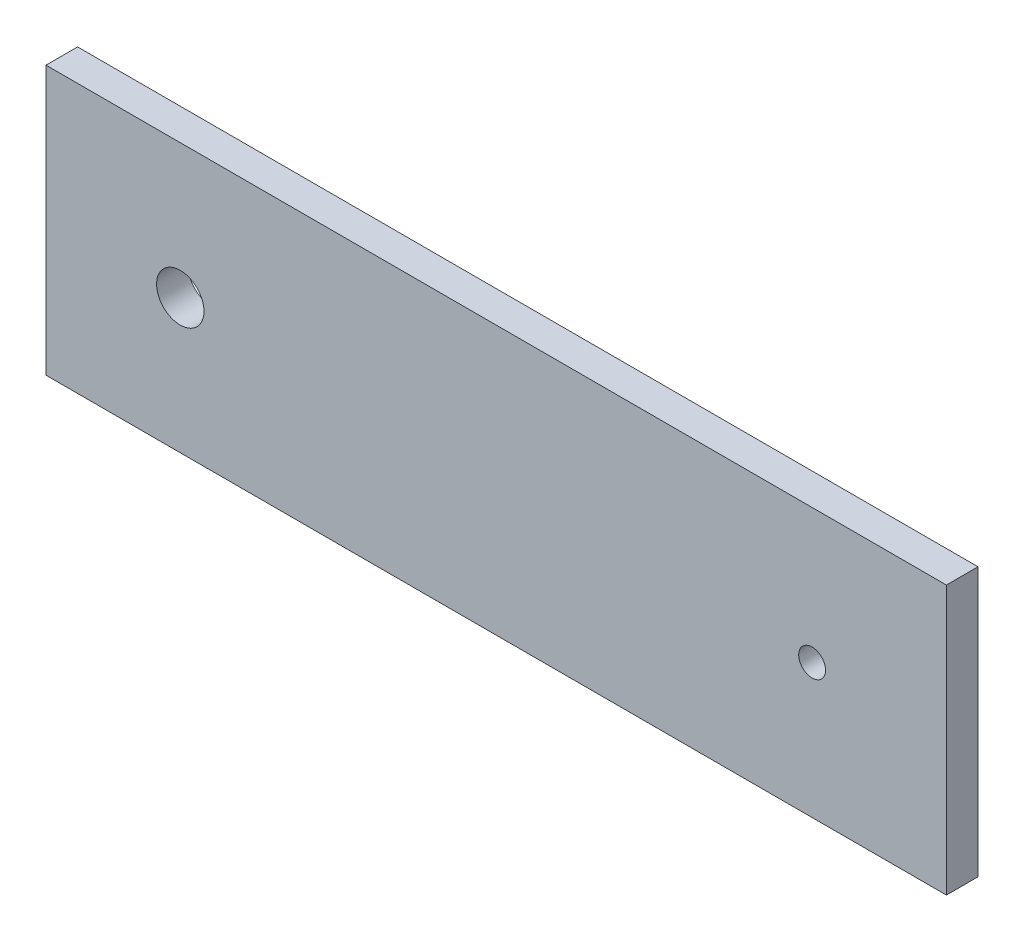
ISO-10303-21;
HEADER;
FILE_DESCRIPTION(('STEP AP214'),'2;1');
FILE_NAME('part.step','',(''),(''),'','','');
FILE_SCHEMA(('AUTOMOTIVE_DESIGN { 1 0 10303 214 1 1 1 1 }'));
ENDSEC;
DATA;
#1=APPLICATION_CONTEXT('core data for automotive mechanical design processes');
#2=APPLICATION_PROTOCOL_DEFINITION('international standard','automotive_design',2000,#1);
#3=PRODUCT_CONTEXT('',#1,'mechanical');
#4=PRODUCT('Part','Part','',(#3));
#5=PRODUCT_RELATED_PRODUCT_CATEGORY('part','',(#4));
#6=PRODUCT_DEFINITION_FORMATION('','',#4);
#7=PRODUCT_DEFINITION_CONTEXT('part definition',#1,'design');
#8=PRODUCT_DEFINITION('design','',#6,#7);
#9=PRODUCT_DEFINITION_SHAPE('','',#8);
#10=(LENGTH_UNIT() NAMED_UNIT(*) SI_UNIT(.MILLI.,.METRE.));
#11=(NAMED_UNIT(*) PLANE_ANGLE_UNIT() SI_UNIT($,.RADIAN.));
#12=(NAMED_UNIT(*) SI_UNIT($,.STERADIAN.) SOLID_ANGLE_UNIT());
#13=UNCERTAINTY_MEASURE_WITH_UNIT(LENGTH_MEASURE(1.E-05),#10,'distance_accuracy_value','');
#14=(GEOMETRIC_REPRESENTATION_CONTEXT(3) GLOBAL_UNCERTAINTY_ASSIGNED_CONTEXT((#13)) GLOBAL_UNIT_ASSIGNED_CONTEXT((#10,
#11,#12)) REPRESENTATION_CONTEXT('',''));
#15=CARTESIAN_POINT('',(0.,0.,0.));
#16=DIRECTION('',(0.,0.,1.));
#17=DIRECTION('',(1.,0.,0.));
#18=AXIS2_PLACEMENT_3D('',#15,#16,#17);
#19=CARTESIAN_POINT('',(0.,0.,2.));
#20=DIRECTION('',(0.,0.,-1.));
#21=DIRECTION('',(-1.,0.,0.));
#22=AXIS2_PLACEMENT_3D('',#19,#20,#21);
#23=PLANE('',#22);
#24=DIRECTION('',(0.,1.,0.));
#25=VECTOR('',#24,1.);
#26=CARTESIAN_POINT('',(97.,-17.,2.));
#27=LINE('',#26,#25);
#28=CARTESIAN_POINT('',(97.,-17.,2.));
#29=VERTEX_POINT('',#28);
#30=CARTESIAN_POINT('',(97.,17.,2.));
#31=VERTEX_POINT('',#30);
#32=EDGE_CURVE('E99',#29,#31,#27,.T.);
#33=ORIENTED_EDGE('',*,*,#32,.T.);
#34=DIRECTION('',(-1.,0.,0.));
#35=VECTOR('',#34,1.);
#36=CARTESIAN_POINT('',(-17.,17.,2.));
#37=LINE('',#36,#35);
#38=CARTESIAN_POINT('',(-17.,17.,2.));
#39=VERTEX_POINT('',#38);
#40=EDGE_CURVE('E92',#31,#39,#37,.T.);
#41=ORIENTED_EDGE('',*,*,#40,.T.);
#42=DIRECTION('',(0.,-1.,0.));
#43=VECTOR('',#42,1.);
#44=CARTESIAN_POINT('',(-17.,-17.,2.));
#45=LINE('',#44,#43);
#46=CARTESIAN_POINT('',(-17.,-17.,2.));
#47=VERTEX_POINT('',#46);
#48=EDGE_CURVE('E98',#39,#47,#45,.T.);
#49=ORIENTED_EDGE('',*,*,#48,.T.);
#50=DIRECTION('',(1.,0.,0.));
#51=VECTOR('',#50,1.);
#52=CARTESIAN_POINT('',(-17.,-17.,2.));
#53=LINE('',#52,#51);
#54=EDGE_CURVE('E63',#47,#29,#53,.T.);
#55=ORIENTED_EDGE('',*,*,#54,.T.);
#56=EDGE_LOOP('',(#33,#41,#49,#55));
#57=FACE_BOUND('',#56,.T.);
#58=CARTESIAN_POINT('',(0.,0.,2.));
#59=DIRECTION('',(0.,0.,1.));
#60=DIRECTION('',(1.,0.,0.));
#61=AXIS2_PLACEMENT_3D('',#58,#59,#60);
#62=CIRCLE('',#61,3.);
#63=CARTESIAN_POINT('',(3.,0.,2.));
#64=VERTEX_POINT('',#63);
#65=EDGE_CURVE('E113',#64,#64,#62,.T.);
#66=ORIENTED_EDGE('',*,*,#65,.F.);
#67=EDGE_LOOP('',(#66));
#68=FACE_BOUND('',#67,.T.);
#69=CARTESIAN_POINT('',(80.,0.,2.));
#70=DIRECTION('',(0.,0.,1.));
#71=DIRECTION('',(1.,0.,0.));
#72=AXIS2_PLACEMENT_3D('',#69,#70,#71);
#73=CIRCLE('',#72,1.69999999999999);
#74=CARTESIAN_POINT('',(81.7,0.,2.));
#75=VERTEX_POINT('',#74);
#76=EDGE_CURVE('E128',#75,#75,#73,.T.);
#77=ORIENTED_EDGE('',*,*,#76,.F.);
#78=EDGE_LOOP('',(#77));
#79=FACE_BOUND('',#78,.T.);
#80=ADVANCED_FACE('F50',(#57,#68,#79),#23,.F.);
#81=CARTESIAN_POINT('',(0.,0.,-2.));
#82=DIRECTION('',(0.,0.,-1.));
#83=DIRECTION('',(-1.,0.,0.));
#84=AXIS2_PLACEMENT_3D('',#81,#82,#83);
#85=PLANE('',#84);
#86=CARTESIAN_POINT('',(0.,0.,-2.));
#87=DIRECTION('',(0.,0.,1.));
#88=DIRECTION('',(1.,0.,0.));
#89=AXIS2_PLACEMENT_3D('',#86,#87,#88);
#90=CIRCLE('',#89,3.);
#91=CARTESIAN_POINT('',(3.,0.,-2.));
#92=VERTEX_POINT('',#91);
#93=EDGE_CURVE('E130',#92,#92,#90,.T.);
#94=ORIENTED_EDGE('',*,*,#93,.T.);
#95=EDGE_LOOP('',(#94));
#96=FACE_BOUND('',#95,.T.);
#97=DIRECTION('',(0.,1.,0.));
#98=VECTOR('',#97,1.);
#99=CARTESIAN_POINT('',(97.,-17.,-2.));
#100=LINE('',#99,#98);
#101=CARTESIAN_POINT('',(97.,-17.,-2.));
#102=VERTEX_POINT('',#101);
#103=CARTESIAN_POINT('',(97.,17.,-2.));
#104=VERTEX_POINT('',#103);
#105=EDGE_CURVE('E115',#102,#104,#100,.T.);
#106=ORIENTED_EDGE('',*,*,#105,.F.);
#107=DIRECTION('',(1.,0.,0.));
#108=VECTOR('',#107,1.);
#109=CARTESIAN_POINT('',(-17.,-17.,-2.));
#110=LINE('',#109,#108);
#111=CARTESIAN_POINT('',(-17.,-17.,-2.));
#112=VERTEX_POINT('',#111);
#113=EDGE_CURVE('E86',#112,#102,#110,.T.);
#114=ORIENTED_EDGE('',*,*,#113,.F.);
#115=DIRECTION('',(0.,-1.,0.));
#116=VECTOR('',#115,1.);
#117=CARTESIAN_POINT('',(-17.,-17.,-2.));
#118=LINE('',#117,#116);
#119=CARTESIAN_POINT('',(-17.,17.,-2.));
#120=VERTEX_POINT('',#119);
#121=EDGE_CURVE('E82',#120,#112,#118,.T.);
#122=ORIENTED_EDGE('',*,*,#121,.F.);
#123=DIRECTION('',(-1.,0.,0.));
#124=VECTOR('',#123,1.);
#125=CARTESIAN_POINT('',(-17.,17.,-2.));
#126=LINE('',#125,#124);
#127=EDGE_CURVE('E102',#104,#120,#126,.T.);
#128=ORIENTED_EDGE('',*,*,#127,.F.);
#129=EDGE_LOOP('',(#106,#114,#122,#128));
#130=FACE_BOUND('',#129,.T.);
#131=CARTESIAN_POINT('',(80.,0.,-2.));
#132=DIRECTION('',(0.,0.,1.));
#133=DIRECTION('',(1.,0.,0.));
#134=AXIS2_PLACEMENT_3D('',#131,#132,#133);
#135=CIRCLE('',#134,1.69999999999999);
#136=CARTESIAN_POINT('',(81.7,0.,-2.));
#137=VERTEX_POINT('',#136);
#138=EDGE_CURVE('E135',#137,#137,#135,.T.);
#139=ORIENTED_EDGE('',*,*,#138,.T.);
#140=EDGE_LOOP('',(#139));
#141=FACE_BOUND('',#140,.T.);
#142=ADVANCED_FACE('F124',(#96,#130,#141),#85,.T.);
#143=CARTESIAN_POINT('',(97.,-17.,2.));
#144=DIRECTION('',(-1.,0.,0.));
#145=DIRECTION('',(0.,0.,1.));
#146=AXIS2_PLACEMENT_3D('',#143,#144,#145);
#147=PLANE('',#146);
#148=ORIENTED_EDGE('',*,*,#105,.T.);
#149=DIRECTION('',(0.,0.,-1.));
#150=VECTOR('',#149,1.);
#151=CARTESIAN_POINT('',(97.,17.,2.));
#152=LINE('',#151,#150);
#153=EDGE_CURVE('E11',#31,#104,#152,.T.);
#154=ORIENTED_EDGE('',*,*,#153,.F.);
#155=ORIENTED_EDGE('',*,*,#32,.F.);
#156=DIRECTION('',(0.,0.,-1.));
#157=VECTOR('',#156,1.);
#158=CARTESIAN_POINT('',(97.,-17.,2.));
#159=LINE('',#158,#157);
#160=EDGE_CURVE('E107',#29,#102,#159,.T.);
#161=ORIENTED_EDGE('',*,*,#160,.T.);
#162=EDGE_LOOP('',(#148,#154,#155,#161));
#163=FACE_BOUND('',#162,.T.);
#164=ADVANCED_FACE('F49',(#163),#147,.F.);
#165=CARTESIAN_POINT('',(-17.,17.,2.));
#166=DIRECTION('',(0.,-1.,0.));
#167=DIRECTION('',(0.,0.,-1.));
#168=AXIS2_PLACEMENT_3D('',#165,#166,#167);
#169=PLANE('',#168);
#170=ORIENTED_EDGE('',*,*,#127,.T.);
#171=DIRECTION('',(0.,0.,-1.));
#172=VECTOR('',#171,1.);
#173=CARTESIAN_POINT('',(-17.,17.,2.));
#174=LINE('',#173,#172);
#175=EDGE_CURVE('E60',#39,#120,#174,.T.);
#176=ORIENTED_EDGE('',*,*,#175,.F.);
#177=ORIENTED_EDGE('',*,*,#40,.F.);
#178=ORIENTED_EDGE('',*,*,#153,.T.);
#179=EDGE_LOOP('',(#170,#176,#177,#178));
#180=FACE_BOUND('',#179,.T.);
#181=ADVANCED_FACE('F103',(#180),#169,.F.);
#182=CARTESIAN_POINT('',(-17.,-17.,2.));
#183=DIRECTION('',(1.,0.,0.));
#184=DIRECTION('',(0.,0.,-1.));
#185=AXIS2_PLACEMENT_3D('',#182,#183,#184);
#186=PLANE('',#185);
#187=ORIENTED_EDGE('',*,*,#121,.T.);
#188=DIRECTION('',(0.,0.,-1.));
#189=VECTOR('',#188,1.);
#190=CARTESIAN_POINT('',(-17.,-17.,2.));
#191=LINE('',#190,#189);
#192=EDGE_CURVE('E104',#47,#112,#191,.T.);
#193=ORIENTED_EDGE('',*,*,#192,.F.);
#194=ORIENTED_EDGE('',*,*,#48,.F.);
#195=ORIENTED_EDGE('',*,*,#175,.T.);
#196=EDGE_LOOP('',(#187,#193,#194,#195));
#197=FACE_BOUND('',#196,.T.);
#198=ADVANCED_FACE('F106',(#197),#186,.F.);
#199=CARTESIAN_POINT('',(-17.,-17.,2.));
#200=DIRECTION('',(0.,1.,0.));
#201=DIRECTION('',(0.,0.,1.));
#202=AXIS2_PLACEMENT_3D('',#199,#200,#201);
#203=PLANE('',#202);
#204=ORIENTED_EDGE('',*,*,#113,.T.);
#205=ORIENTED_EDGE('',*,*,#160,.F.);
#206=ORIENTED_EDGE('',*,*,#54,.F.);
#207=ORIENTED_EDGE('',*,*,#192,.T.);
#208=EDGE_LOOP('',(#204,#205,#206,#207));
#209=FACE_BOUND('',#208,.T.);
#210=ADVANCED_FACE('F118',(#209),#203,.F.);
#211=CARTESIAN_POINT('',(0.,0.,2.));
#212=DIRECTION('',(0.,0.,-1.));
#213=DIRECTION('',(-1.,0.,0.));
#214=AXIS2_PLACEMENT_3D('',#211,#212,#213);
#215=CYLINDRICAL_SURFACE('',#214,3.);
#216=ORIENTED_EDGE('',*,*,#65,.T.);
#217=EDGE_LOOP('',(#216));
#218=FACE_BOUND('',#217,.T.);
#219=ORIENTED_EDGE('',*,*,#93,.F.);
#220=EDGE_LOOP('',(#219));
#221=FACE_BOUND('',#220,.T.);
#222=ADVANCED_FACE('F153',(#218,#221),#215,.F.);
#223=CARTESIAN_POINT('',(80.,0.,2.));
#224=DIRECTION('',(0.,0.,-1.));
#225=DIRECTION('',(-1.,0.,0.));
#226=AXIS2_PLACEMENT_3D('',#223,#224,#225);
#227=CYLINDRICAL_SURFACE('',#226,1.69999999999999);
#228=ORIENTED_EDGE('',*,*,#76,.T.);
#229=EDGE_LOOP('',(#228));
#230=FACE_BOUND('',#229,.T.);
#231=ORIENTED_EDGE('',*,*,#138,.F.);
#232=EDGE_LOOP('',(#231));
#233=FACE_BOUND('',#232,.T.);
#234=ADVANCED_FACE('F138',(#230,#233),#227,.F.);
#235=CLOSED_SHELL('',(#80,#142,#164,#181,#198,#210,#222,#234));
#236=MANIFOLD_SOLID_BREP('B2',#235);
#237=ADVANCED_BREP_SHAPE_REPRESENTATION('',(#18,#236),#14);
#238=SHAPE_DEFINITION_REPRESENTATION(#9,#237);
ENDSEC;
END-ISO-10303-21;
